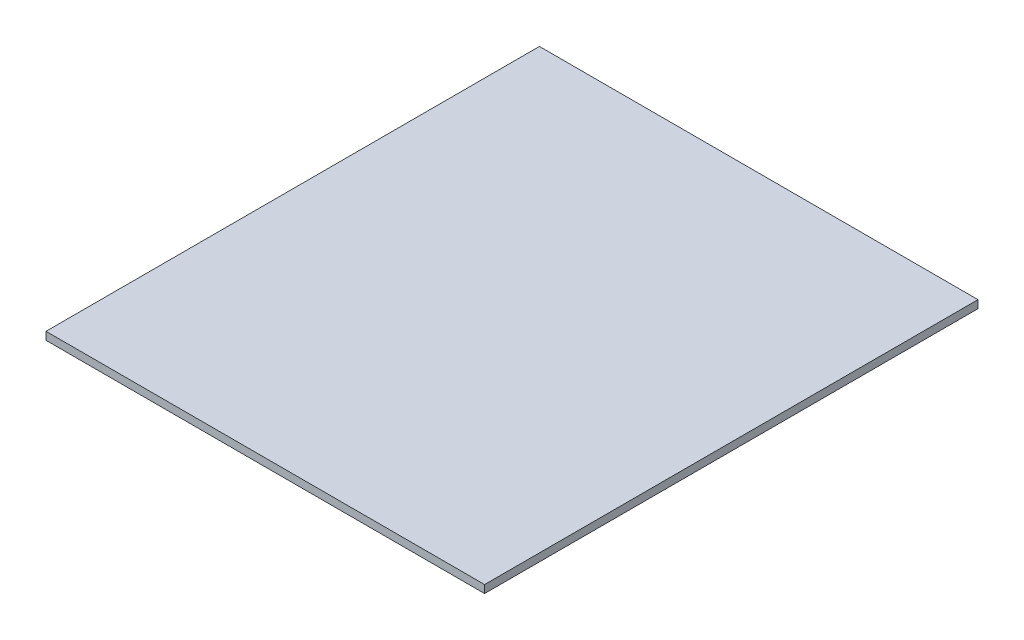
ISO-10303-21;
HEADER;
FILE_DESCRIPTION(('STEP AP214'),'2;1');
FILE_NAME('part.step','',(''),(''),'','','');
FILE_SCHEMA(('AUTOMOTIVE_DESIGN { 1 0 10303 214 1 1 1 1 }'));
ENDSEC;
DATA;
#1=APPLICATION_CONTEXT('core data for automotive mechanical design processes');
#2=APPLICATION_PROTOCOL_DEFINITION('international standard','automotive_design',2000,#1);
#3=PRODUCT_CONTEXT('',#1,'mechanical');
#4=PRODUCT('Part','Part','',(#3));
#5=PRODUCT_RELATED_PRODUCT_CATEGORY('part','',(#4));
#6=PRODUCT_DEFINITION_FORMATION('','',#4);
#7=PRODUCT_DEFINITION_CONTEXT('part definition',#1,'design');
#8=PRODUCT_DEFINITION('design','',#6,#7);
#9=PRODUCT_DEFINITION_SHAPE('','',#8);
#10=(LENGTH_UNIT() NAMED_UNIT(*) SI_UNIT(.MILLI.,.METRE.));
#11=(NAMED_UNIT(*) PLANE_ANGLE_UNIT() SI_UNIT($,.RADIAN.));
#12=(NAMED_UNIT(*) SI_UNIT($,.STERADIAN.) SOLID_ANGLE_UNIT());
#13=UNCERTAINTY_MEASURE_WITH_UNIT(LENGTH_MEASURE(1.E-05),#10,'distance_accuracy_value','');
#14=(GEOMETRIC_REPRESENTATION_CONTEXT(3) GLOBAL_UNCERTAINTY_ASSIGNED_CONTEXT((#13)) GLOBAL_UNIT_ASSIGNED_CONTEXT((#10,
#11,#12)) REPRESENTATION_CONTEXT('',''));
#15=CARTESIAN_POINT('',(0.,0.,0.));
#16=DIRECTION('',(0.,0.,1.));
#17=DIRECTION('',(1.,0.,0.));
#18=AXIS2_PLACEMENT_3D('',#15,#16,#17);
#19=CARTESIAN_POINT('',(0.,6.35,0.));
#20=DIRECTION('',(1.,0.,0.));
#21=DIRECTION('',(0.,0.,-1.));
#22=AXIS2_PLACEMENT_3D('',#19,#20,#21);
#23=PLANE('',#22);
#24=DIRECTION('',(0.,0.,1.));
#25=VECTOR('',#24,1.);
#26=CARTESIAN_POINT('',(0.,0.,0.));
#27=LINE('',#26,#25);
#28=CARTESIAN_POINT('',(0.,0.,-400.05));
#29=VERTEX_POINT('',#28);
#30=CARTESIAN_POINT('',(0.,0.,0.));
#31=VERTEX_POINT('',#30);
#32=EDGE_CURVE('E96',#29,#31,#27,.T.);
#33=ORIENTED_EDGE('',*,*,#32,.T.);
#34=DIRECTION('',(0.,-1.,0.));
#35=VECTOR('',#34,1.);
#36=CARTESIAN_POINT('',(0.,6.35,0.));
#37=LINE('',#36,#35);
#38=CARTESIAN_POINT('',(0.,6.35,0.));
#39=VERTEX_POINT('',#38);
#40=EDGE_CURVE('E11',#39,#31,#37,.T.);
#41=ORIENTED_EDGE('',*,*,#40,.F.);
#42=DIRECTION('',(0.,0.,1.));
#43=VECTOR('',#42,1.);
#44=CARTESIAN_POINT('',(0.,6.35,0.));
#45=LINE('',#44,#43);
#46=CARTESIAN_POINT('',(0.,6.35,-400.05));
#47=VERTEX_POINT('',#46);
#48=EDGE_CURVE('E84',#47,#39,#45,.T.);
#49=ORIENTED_EDGE('',*,*,#48,.F.);
#50=DIRECTION('',(0.,-1.,0.));
#51=VECTOR('',#50,1.);
#52=CARTESIAN_POINT('',(0.,6.35,-400.05));
#53=LINE('',#52,#51);
#54=EDGE_CURVE('E92',#47,#29,#53,.T.);
#55=ORIENTED_EDGE('',*,*,#54,.T.);
#56=EDGE_LOOP('',(#33,#41,#49,#55));
#57=FACE_BOUND('',#56,.T.);
#58=ADVANCED_FACE('F33',(#57),#23,.F.);
#59=CARTESIAN_POINT('',(0.,6.35,0.));
#60=DIRECTION('',(0.,0.,-1.));
#61=DIRECTION('',(-1.,0.,0.));
#62=AXIS2_PLACEMENT_3D('',#59,#60,#61);
#63=PLANE('',#62);
#64=DIRECTION('',(1.,0.,0.));
#65=VECTOR('',#64,1.);
#66=CARTESIAN_POINT('',(0.,0.,0.));
#67=LINE('',#66,#65);
#68=CARTESIAN_POINT('',(355.6,0.,0.));
#69=VERTEX_POINT('',#68);
#70=EDGE_CURVE('E88',#31,#69,#67,.T.);
#71=ORIENTED_EDGE('',*,*,#70,.T.);
#72=DIRECTION('',(0.,-1.,0.));
#73=VECTOR('',#72,1.);
#74=CARTESIAN_POINT('',(355.6,6.35,0.));
#75=LINE('',#74,#73);
#76=CARTESIAN_POINT('',(355.6,6.35,0.));
#77=VERTEX_POINT('',#76);
#78=EDGE_CURVE('E41',#77,#69,#75,.T.);
#79=ORIENTED_EDGE('',*,*,#78,.F.);
#80=DIRECTION('',(1.,0.,0.));
#81=VECTOR('',#80,1.);
#82=CARTESIAN_POINT('',(0.,6.35,0.));
#83=LINE('',#82,#81);
#84=EDGE_CURVE('E79',#39,#77,#83,.T.);
#85=ORIENTED_EDGE('',*,*,#84,.F.);
#86=ORIENTED_EDGE('',*,*,#40,.T.);
#87=EDGE_LOOP('',(#71,#79,#85,#86));
#88=FACE_BOUND('',#87,.T.);
#89=ADVANCED_FACE('F87',(#88),#63,.F.);
#90=CARTESIAN_POINT('',(355.6,6.35,0.));
#91=DIRECTION('',(-1.,0.,0.));
#92=DIRECTION('',(0.,0.,1.));
#93=AXIS2_PLACEMENT_3D('',#90,#91,#92);
#94=PLANE('',#93);
#95=DIRECTION('',(0.,0.,-1.));
#96=VECTOR('',#95,1.);
#97=CARTESIAN_POINT('',(355.6,0.,0.));
#98=LINE('',#97,#96);
#99=CARTESIAN_POINT('',(355.6,0.,-400.05));
#100=VERTEX_POINT('',#99);
#101=EDGE_CURVE('E66',#69,#100,#98,.T.);
#102=ORIENTED_EDGE('',*,*,#101,.T.);
#103=DIRECTION('',(0.,-1.,0.));
#104=VECTOR('',#103,1.);
#105=CARTESIAN_POINT('',(355.6,6.35,-400.05));
#106=LINE('',#105,#104);
#107=CARTESIAN_POINT('',(355.6,6.35,-400.05));
#108=VERTEX_POINT('',#107);
#109=EDGE_CURVE('E89',#108,#100,#106,.T.);
#110=ORIENTED_EDGE('',*,*,#109,.F.);
#111=DIRECTION('',(0.,0.,-1.));
#112=VECTOR('',#111,1.);
#113=CARTESIAN_POINT('',(355.6,6.35,0.));
#114=LINE('',#113,#112);
#115=EDGE_CURVE('E82',#77,#108,#114,.T.);
#116=ORIENTED_EDGE('',*,*,#115,.F.);
#117=ORIENTED_EDGE('',*,*,#78,.T.);
#118=EDGE_LOOP('',(#102,#110,#116,#117));
#119=FACE_BOUND('',#118,.T.);
#120=ADVANCED_FACE('F90',(#119),#94,.F.);
#121=CARTESIAN_POINT('',(0.,6.35,-400.05));
#122=DIRECTION('',(0.,0.,1.));
#123=DIRECTION('',(1.,0.,0.));
#124=AXIS2_PLACEMENT_3D('',#121,#122,#123);
#125=PLANE('',#124);
#126=DIRECTION('',(-1.,0.,0.));
#127=VECTOR('',#126,1.);
#128=CARTESIAN_POINT('',(0.,0.,-400.05));
#129=LINE('',#128,#127);
#130=EDGE_CURVE('E72',#100,#29,#129,.T.);
#131=ORIENTED_EDGE('',*,*,#130,.T.);
#132=ORIENTED_EDGE('',*,*,#54,.F.);
#133=DIRECTION('',(-1.,0.,0.));
#134=VECTOR('',#133,1.);
#135=CARTESIAN_POINT('',(0.,6.35,-400.05));
#136=LINE('',#135,#134);
#137=EDGE_CURVE('E49',#108,#47,#136,.T.);
#138=ORIENTED_EDGE('',*,*,#137,.F.);
#139=ORIENTED_EDGE('',*,*,#109,.T.);
#140=EDGE_LOOP('',(#131,#132,#138,#139));
#141=FACE_BOUND('',#140,.T.);
#142=ADVANCED_FACE('F103',(#141),#125,.F.);
#143=CARTESIAN_POINT('',(0.,6.35,0.));
#144=DIRECTION('',(0.,-1.,0.));
#145=DIRECTION('',(0.,0.,-1.));
#146=AXIS2_PLACEMENT_3D('',#143,#144,#145);
#147=PLANE('',#146);
#148=ORIENTED_EDGE('',*,*,#48,.T.);
#149=ORIENTED_EDGE('',*,*,#84,.T.);
#150=ORIENTED_EDGE('',*,*,#115,.T.);
#151=ORIENTED_EDGE('',*,*,#137,.T.);
#152=EDGE_LOOP('',(#148,#149,#150,#151));
#153=FACE_BOUND('',#152,.T.);
#154=ADVANCED_FACE('F80',(#153),#147,.F.);
#155=CARTESIAN_POINT('',(0.,0.,0.));
#156=DIRECTION('',(0.,-1.,0.));
#157=DIRECTION('',(0.,0.,-1.));
#158=AXIS2_PLACEMENT_3D('',#155,#156,#157);
#159=PLANE('',#158);
#160=ORIENTED_EDGE('',*,*,#32,.F.);
#161=ORIENTED_EDGE('',*,*,#130,.F.);
#162=ORIENTED_EDGE('',*,*,#101,.F.);
#163=ORIENTED_EDGE('',*,*,#70,.F.);
#164=EDGE_LOOP('',(#160,#161,#162,#163));
#165=FACE_BOUND('',#164,.T.);
#166=ADVANCED_FACE('F106',(#165),#159,.T.);
#167=CLOSED_SHELL('',(#58,#89,#120,#142,#154,#166));
#168=MANIFOLD_SOLID_BREP('B2',#167);
#169=ADVANCED_BREP_SHAPE_REPRESENTATION('',(#18,#168),#14);
#170=SHAPE_DEFINITION_REPRESENTATION(#9,#169);
ENDSEC;
END-ISO-10303-21;
